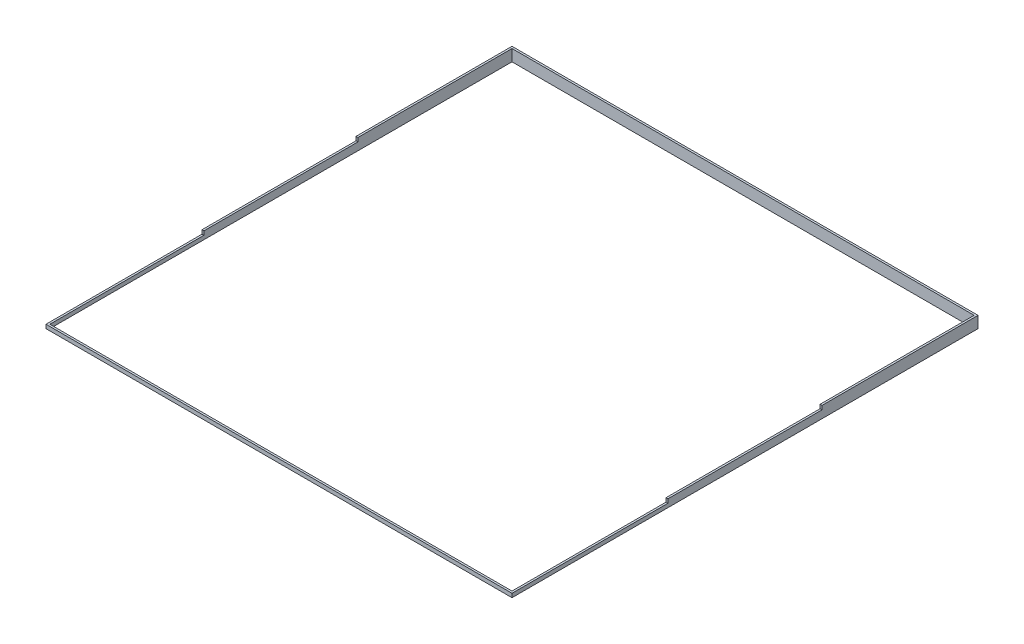
ISO-10303-21;
HEADER;
FILE_DESCRIPTION(('STEP AP214'),'2;1');
FILE_NAME('part.step','',(''),(''),'','','');
FILE_SCHEMA(('AUTOMOTIVE_DESIGN { 1 0 10303 214 1 1 1 1 }'));
ENDSEC;
DATA;
#1=APPLICATION_CONTEXT('core data for automotive mechanical design processes');
#2=APPLICATION_PROTOCOL_DEFINITION('international standard','automotive_design',2000,#1);
#3=PRODUCT_CONTEXT('',#1,'mechanical');
#4=PRODUCT('Part','Part','',(#3));
#5=PRODUCT_RELATED_PRODUCT_CATEGORY('part','',(#4));
#6=PRODUCT_DEFINITION_FORMATION('','',#4);
#7=PRODUCT_DEFINITION_CONTEXT('part definition',#1,'design');
#8=PRODUCT_DEFINITION('design','',#6,#7);
#9=PRODUCT_DEFINITION_SHAPE('','',#8);
#10=(LENGTH_UNIT() NAMED_UNIT(*) SI_UNIT(.MILLI.,.METRE.));
#11=(NAMED_UNIT(*) PLANE_ANGLE_UNIT() SI_UNIT($,.RADIAN.));
#12=(NAMED_UNIT(*) SI_UNIT($,.STERADIAN.) SOLID_ANGLE_UNIT());
#13=UNCERTAINTY_MEASURE_WITH_UNIT(LENGTH_MEASURE(1.E-05),#10,'distance_accuracy_value','');
#14=(GEOMETRIC_REPRESENTATION_CONTEXT(3) GLOBAL_UNCERTAINTY_ASSIGNED_CONTEXT((#13)) GLOBAL_UNIT_ASSIGNED_CONTEXT((#10,
#11,#12)) REPRESENTATION_CONTEXT('',''));
#15=CARTESIAN_POINT('',(0.,0.,0.));
#16=DIRECTION('',(0.,0.,1.));
#17=DIRECTION('',(1.,0.,0.));
#18=AXIS2_PLACEMENT_3D('',#15,#16,#17);
#19=CARTESIAN_POINT('',(-6050.,300.,-6050.));
#20=DIRECTION('',(1.,0.,0.));
#21=DIRECTION('',(0.,0.,-1.));
#22=AXIS2_PLACEMENT_3D('',#19,#20,#21);
#23=PLANE('',#22);
#24=DIRECTION('',(0.,-1.,0.));
#25=VECTOR('',#24,1.);
#26=CARTESIAN_POINT('',(-6050.,300.,6050.));
#27=LINE('',#26,#25);
#28=CARTESIAN_POINT('',(-6050.,100.,6050.));
#29=VERTEX_POINT('',#28);
#30=CARTESIAN_POINT('',(-6050.,0.,6050.));
#31=VERTEX_POINT('',#30);
#32=EDGE_CURVE('E176',#29,#31,#27,.T.);
#33=ORIENTED_EDGE('',*,*,#32,.F.);
#34=DIRECTION('',(0.,0.,1.));
#35=VECTOR('',#34,1.);
#36=CARTESIAN_POINT('',(-6050.,100.,6000.));
#37=LINE('',#36,#35);
#38=CARTESIAN_POINT('',(-6050.,100.,2000.));
#39=VERTEX_POINT('',#38);
#40=EDGE_CURVE('E160',#39,#29,#37,.T.);
#41=ORIENTED_EDGE('',*,*,#40,.F.);
#42=DIRECTION('',(0.,1.,0.));
#43=VECTOR('',#42,1.);
#44=CARTESIAN_POINT('',(-6050.,100.,2000.));
#45=LINE('',#44,#43);
#46=CARTESIAN_POINT('',(-6050.,200.,2000.));
#47=VERTEX_POINT('',#46);
#48=EDGE_CURVE('E280',#39,#47,#45,.T.);
#49=ORIENTED_EDGE('',*,*,#48,.T.);
#50=DIRECTION('',(0.,0.,1.));
#51=VECTOR('',#50,1.);
#52=CARTESIAN_POINT('',(-6050.,200.,2000.));
#53=LINE('',#52,#51);
#54=CARTESIAN_POINT('',(-6050.,200.,-2000.));
#55=VERTEX_POINT('',#54);
#56=EDGE_CURVE('E68',#55,#47,#53,.T.);
#57=ORIENTED_EDGE('',*,*,#56,.F.);
#58=DIRECTION('',(0.,1.,0.));
#59=VECTOR('',#58,1.);
#60=CARTESIAN_POINT('',(-6050.,200.,-2000.));
#61=LINE('',#60,#59);
#62=CARTESIAN_POINT('',(-6050.,300.,-2000.));
#63=VERTEX_POINT('',#62);
#64=EDGE_CURVE('E290',#55,#63,#61,.T.);
#65=ORIENTED_EDGE('',*,*,#64,.T.);
#66=DIRECTION('',(0.,0.,1.));
#67=VECTOR('',#66,1.);
#68=CARTESIAN_POINT('',(-6050.,300.,-6050.));
#69=LINE('',#68,#67);
#70=CARTESIAN_POINT('',(-6050.,300.,-6050.));
#71=VERTEX_POINT('',#70);
#72=EDGE_CURVE('E198',#71,#63,#69,.T.);
#73=ORIENTED_EDGE('',*,*,#72,.F.);
#74=DIRECTION('',(0.,-1.,0.));
#75=VECTOR('',#74,1.);
#76=CARTESIAN_POINT('',(-6050.,300.,-6050.));
#77=LINE('',#76,#75);
#78=CARTESIAN_POINT('',(-6050.,0.,-6050.));
#79=VERTEX_POINT('',#78);
#80=EDGE_CURVE('E186',#71,#79,#77,.T.);
#81=ORIENTED_EDGE('',*,*,#80,.T.);
#82=DIRECTION('',(0.,0.,1.));
#83=VECTOR('',#82,1.);
#84=CARTESIAN_POINT('',(-6050.,0.,-6050.));
#85=LINE('',#84,#83);
#86=EDGE_CURVE('E183',#79,#31,#85,.T.);
#87=ORIENTED_EDGE('',*,*,#86,.T.);
#88=EDGE_LOOP('',(#33,#41,#49,#57,#65,#73,#81,#87));
#89=FACE_BOUND('',#88,.T.);
#90=ADVANCED_FACE('F44',(#89),#23,.F.);
#91=CARTESIAN_POINT('',(-6050.,300.,6050.));
#92=DIRECTION('',(0.,0.,-1.));
#93=DIRECTION('',(-1.,0.,0.));
#94=AXIS2_PLACEMENT_3D('',#91,#92,#93);
#95=PLANE('',#94);
#96=DIRECTION('',(1.,0.,0.));
#97=VECTOR('',#96,1.);
#98=CARTESIAN_POINT('',(-6050.,100.,6050.));
#99=LINE('',#98,#97);
#100=CARTESIAN_POINT('',(6050.,100.,6050.));
#101=VERTEX_POINT('',#100);
#102=EDGE_CURVE('E164',#29,#101,#99,.T.);
#103=ORIENTED_EDGE('',*,*,#102,.F.);
#104=ORIENTED_EDGE('',*,*,#32,.T.);
#105=DIRECTION('',(1.,0.,0.));
#106=VECTOR('',#105,1.);
#107=CARTESIAN_POINT('',(-6050.,0.,6050.));
#108=LINE('',#107,#106);
#109=CARTESIAN_POINT('',(6050.,0.,6050.));
#110=VERTEX_POINT('',#109);
#111=EDGE_CURVE('E269',#31,#110,#108,.T.);
#112=ORIENTED_EDGE('',*,*,#111,.T.);
#113=DIRECTION('',(0.,-1.,0.));
#114=VECTOR('',#113,1.);
#115=CARTESIAN_POINT('',(6050.,300.,6050.));
#116=LINE('',#115,#114);
#117=EDGE_CURVE('E178',#101,#110,#116,.T.);
#118=ORIENTED_EDGE('',*,*,#117,.F.);
#119=EDGE_LOOP('',(#103,#104,#112,#118));
#120=FACE_BOUND('',#119,.T.);
#121=ADVANCED_FACE('F174',(#120),#95,.F.);
#122=CARTESIAN_POINT('',(6050.,300.,-6050.));
#123=DIRECTION('',(1.,0.,0.));
#124=DIRECTION('',(0.,0.,-1.));
#125=AXIS2_PLACEMENT_3D('',#122,#123,#124);
#126=PLANE('',#125);
#127=DIRECTION('',(0.,0.,-1.));
#128=VECTOR('',#127,1.);
#129=CARTESIAN_POINT('',(6050.,100.,6000.));
#130=LINE('',#129,#128);
#131=CARTESIAN_POINT('',(6050.,100.,2000.));
#132=VERTEX_POINT('',#131);
#133=EDGE_CURVE('E324',#101,#132,#130,.T.);
#134=ORIENTED_EDGE('',*,*,#133,.F.);
#135=ORIENTED_EDGE('',*,*,#117,.T.);
#136=DIRECTION('',(0.,0.,1.));
#137=VECTOR('',#136,1.);
#138=CARTESIAN_POINT('',(6050.,0.,-6050.));
#139=LINE('',#138,#137);
#140=CARTESIAN_POINT('',(6050.,0.,-6050.));
#141=VERTEX_POINT('',#140);
#142=EDGE_CURVE('E265',#141,#110,#139,.T.);
#143=ORIENTED_EDGE('',*,*,#142,.F.);
#144=DIRECTION('',(0.,-1.,0.));
#145=VECTOR('',#144,1.);
#146=CARTESIAN_POINT('',(6050.,300.,-6050.));
#147=LINE('',#146,#145);
#148=CARTESIAN_POINT('',(6050.,300.,-6050.));
#149=VERTEX_POINT('',#148);
#150=EDGE_CURVE('E192',#149,#141,#147,.T.);
#151=ORIENTED_EDGE('',*,*,#150,.F.);
#152=DIRECTION('',(0.,0.,1.));
#153=VECTOR('',#152,1.);
#154=CARTESIAN_POINT('',(6050.,300.,-6050.));
#155=LINE('',#154,#153);
#156=CARTESIAN_POINT('',(6050.,300.,-2000.));
#157=VERTEX_POINT('',#156);
#158=EDGE_CURVE('E254',#149,#157,#155,.T.);
#159=ORIENTED_EDGE('',*,*,#158,.T.);
#160=DIRECTION('',(0.,1.,0.));
#161=VECTOR('',#160,1.);
#162=CARTESIAN_POINT('',(6050.,200.,-2000.));
#163=LINE('',#162,#161);
#164=CARTESIAN_POINT('',(6050.,200.,-2000.));
#165=VERTEX_POINT('',#164);
#166=EDGE_CURVE('E332',#165,#157,#163,.T.);
#167=ORIENTED_EDGE('',*,*,#166,.F.);
#168=DIRECTION('',(0.,0.,-1.));
#169=VECTOR('',#168,1.);
#170=CARTESIAN_POINT('',(6050.,200.,2000.));
#171=LINE('',#170,#169);
#172=CARTESIAN_POINT('',(6050.,200.,2000.));
#173=VERTEX_POINT('',#172);
#174=EDGE_CURVE('E341',#173,#165,#171,.T.);
#175=ORIENTED_EDGE('',*,*,#174,.F.);
#176=DIRECTION('',(0.,1.,0.));
#177=VECTOR('',#176,1.);
#178=CARTESIAN_POINT('',(6050.,100.,2000.));
#179=LINE('',#178,#177);
#180=EDGE_CURVE('E313',#132,#173,#179,.T.);
#181=ORIENTED_EDGE('',*,*,#180,.F.);
#182=EDGE_LOOP('',(#134,#135,#143,#151,#159,#167,#175,#181));
#183=FACE_BOUND('',#182,.T.);
#184=ADVANCED_FACE('F361',(#183),#126,.T.);
#185=CARTESIAN_POINT('',(-6000.,-1.,6000.));
#186=DIRECTION('',(0.,0.,1.));
#187=DIRECTION('',(1.,0.,0.));
#188=AXIS2_PLACEMENT_3D('',#185,#186,#187);
#189=PLANE('',#188);
#190=DIRECTION('',(-1.,0.,0.));
#191=VECTOR('',#190,1.);
#192=CARTESIAN_POINT('',(-6050.,100.,6000.));
#193=LINE('',#192,#191);
#194=CARTESIAN_POINT('',(6000.,100.,6000.));
#195=VERTEX_POINT('',#194);
#196=CARTESIAN_POINT('',(-6000.,100.,6000.));
#197=VERTEX_POINT('',#196);
#198=EDGE_CURVE('E180',#195,#197,#193,.T.);
#199=ORIENTED_EDGE('',*,*,#198,.F.);
#200=DIRECTION('',(0.,1.,0.));
#201=VECTOR('',#200,1.);
#202=CARTESIAN_POINT('',(6000.,-1.,6000.));
#203=LINE('',#202,#201);
#204=CARTESIAN_POINT('',(6000.,0.,6000.));
#205=VERTEX_POINT('',#204);
#206=EDGE_CURVE('E213',#205,#195,#203,.T.);
#207=ORIENTED_EDGE('',*,*,#206,.F.);
#208=DIRECTION('',(-1.,0.,0.));
#209=VECTOR('',#208,1.);
#210=CARTESIAN_POINT('',(0.,0.,6000.));
#211=LINE('',#210,#209);
#212=CARTESIAN_POINT('',(-6000.,0.,6000.));
#213=VERTEX_POINT('',#212);
#214=EDGE_CURVE('E53',#205,#213,#211,.T.);
#215=ORIENTED_EDGE('',*,*,#214,.T.);
#216=DIRECTION('',(0.,1.,0.));
#217=VECTOR('',#216,1.);
#218=CARTESIAN_POINT('',(-6000.,-1.,6000.));
#219=LINE('',#218,#217);
#220=EDGE_CURVE('E211',#213,#197,#219,.T.);
#221=ORIENTED_EDGE('',*,*,#220,.T.);
#222=EDGE_LOOP('',(#199,#207,#215,#221));
#223=FACE_BOUND('',#222,.T.);
#224=ADVANCED_FACE('F210',(#223),#189,.F.);
#225=CARTESIAN_POINT('',(6000.,100.,2000.));
#226=DIRECTION('',(0.,0.,-1.));
#227=DIRECTION('',(-1.,0.,0.));
#228=AXIS2_PLACEMENT_3D('',#225,#226,#227);
#229=PLANE('',#228);
#230=DIRECTION('',(1.,0.,0.));
#231=VECTOR('',#230,1.);
#232=CARTESIAN_POINT('',(6050.,200.,2000.));
#233=LINE('',#232,#231);
#234=CARTESIAN_POINT('',(6000.,200.,2000.));
#235=VERTEX_POINT('',#234);
#236=EDGE_CURVE('E335',#235,#173,#233,.T.);
#237=ORIENTED_EDGE('',*,*,#236,.F.);
#238=DIRECTION('',(0.,1.,0.));
#239=VECTOR('',#238,1.);
#240=CARTESIAN_POINT('',(6000.,100.,2000.));
#241=LINE('',#240,#239);
#242=CARTESIAN_POINT('',(6000.,100.,2000.));
#243=VERTEX_POINT('',#242);
#244=EDGE_CURVE('E302',#243,#235,#241,.T.);
#245=ORIENTED_EDGE('',*,*,#244,.F.);
#246=DIRECTION('',(-1.,0.,0.));
#247=VECTOR('',#246,1.);
#248=CARTESIAN_POINT('',(6000.,100.,2000.));
#249=LINE('',#248,#247);
#250=EDGE_CURVE('E317',#132,#243,#249,.T.);
#251=ORIENTED_EDGE('',*,*,#250,.F.);
#252=ORIENTED_EDGE('',*,*,#180,.T.);
#253=EDGE_LOOP('',(#237,#245,#251,#252));
#254=FACE_BOUND('',#253,.T.);
#255=ADVANCED_FACE('F355',(#254),#229,.F.);
#256=CARTESIAN_POINT('',(0.,300.,0.));
#257=DIRECTION('',(0.,-1.,0.));
#258=DIRECTION('',(0.,0.,-1.));
#259=AXIS2_PLACEMENT_3D('',#256,#257,#258);
#260=PLANE('',#259);
#261=DIRECTION('',(0.,0.,-1.));
#262=VECTOR('',#261,1.);
#263=CARTESIAN_POINT('',(6000.,300.,-6000.));
#264=LINE('',#263,#262);
#265=CARTESIAN_POINT('',(6000.,300.,-2000.));
#266=VERTEX_POINT('',#265);
#267=CARTESIAN_POINT('',(6000.,300.,-6000.));
#268=VERTEX_POINT('',#267);
#269=EDGE_CURVE('E240',#266,#268,#264,.T.);
#270=ORIENTED_EDGE('',*,*,#269,.F.);
#271=DIRECTION('',(-1.,0.,0.));
#272=VECTOR('',#271,1.);
#273=CARTESIAN_POINT('',(6050.,300.,-2000.));
#274=LINE('',#273,#272);
#275=EDGE_CURVE('E338',#157,#266,#274,.T.);
#276=ORIENTED_EDGE('',*,*,#275,.F.);
#277=ORIENTED_EDGE('',*,*,#158,.F.);
#278=DIRECTION('',(1.,0.,0.));
#279=VECTOR('',#278,1.);
#280=CARTESIAN_POINT('',(-6050.,300.,-6050.));
#281=LINE('',#280,#279);
#282=EDGE_CURVE('E250',#71,#149,#281,.T.);
#283=ORIENTED_EDGE('',*,*,#282,.F.);
#284=ORIENTED_EDGE('',*,*,#72,.T.);
#285=DIRECTION('',(-1.,0.,0.));
#286=VECTOR('',#285,1.);
#287=CARTESIAN_POINT('',(-6000.,300.,-2000.));
#288=LINE('',#287,#286);
#289=CARTESIAN_POINT('',(-6000.,300.,-2000.));
#290=VERTEX_POINT('',#289);
#291=EDGE_CURVE('E298',#290,#63,#288,.T.);
#292=ORIENTED_EDGE('',*,*,#291,.F.);
#293=DIRECTION('',(0.,0.,1.));
#294=VECTOR('',#293,1.);
#295=CARTESIAN_POINT('',(-6000.,300.,-6000.));
#296=LINE('',#295,#294);
#297=CARTESIAN_POINT('',(-6000.,300.,-6000.));
#298=VERTEX_POINT('',#297);
#299=EDGE_CURVE('E242',#298,#290,#296,.T.);
#300=ORIENTED_EDGE('',*,*,#299,.F.);
#301=DIRECTION('',(-1.,0.,0.));
#302=VECTOR('',#301,1.);
#303=CARTESIAN_POINT('',(-6000.,300.,-6000.));
#304=LINE('',#303,#302);
#305=EDGE_CURVE('E247',#268,#298,#304,.T.);
#306=ORIENTED_EDGE('',*,*,#305,.F.);
#307=EDGE_LOOP('',(#270,#276,#277,#283,#284,#292,#300,#306));
#308=FACE_BOUND('',#307,.T.);
#309=ADVANCED_FACE('F367',(#308),#260,.F.);
#310=CARTESIAN_POINT('',(-6000.,100.,2000.));
#311=DIRECTION('',(0.,0.,-1.));
#312=DIRECTION('',(-1.,0.,0.));
#313=AXIS2_PLACEMENT_3D('',#310,#311,#312);
#314=PLANE('',#313);
#315=DIRECTION('',(1.,0.,0.));
#316=VECTOR('',#315,1.);
#317=CARTESIAN_POINT('',(-6000.,200.,2000.));
#318=LINE('',#317,#316);
#319=CARTESIAN_POINT('',(-6000.,200.,2000.));
#320=VERTEX_POINT('',#319);
#321=EDGE_CURVE('E294',#47,#320,#318,.T.);
#322=ORIENTED_EDGE('',*,*,#321,.F.);
#323=ORIENTED_EDGE('',*,*,#48,.F.);
#324=DIRECTION('',(-1.,0.,0.));
#325=VECTOR('',#324,1.);
#326=CARTESIAN_POINT('',(-6000.,100.,2000.));
#327=LINE('',#326,#325);
#328=CARTESIAN_POINT('',(-6000.,100.,2000.));
#329=VERTEX_POINT('',#328);
#330=EDGE_CURVE('E166',#329,#39,#327,.T.);
#331=ORIENTED_EDGE('',*,*,#330,.F.);
#332=DIRECTION('',(0.,1.,0.));
#333=VECTOR('',#332,1.);
#334=CARTESIAN_POINT('',(-6000.,100.,2000.));
#335=LINE('',#334,#333);
#336=EDGE_CURVE('E171',#329,#320,#335,.T.);
#337=ORIENTED_EDGE('',*,*,#336,.T.);
#338=EDGE_LOOP('',(#322,#323,#331,#337));
#339=FACE_BOUND('',#338,.T.);
#340=ADVANCED_FACE('F377',(#339),#314,.F.);
#341=CARTESIAN_POINT('',(-6050.,300.,-6050.));
#342=DIRECTION('',(0.,0.,-1.));
#343=DIRECTION('',(-1.,0.,0.));
#344=AXIS2_PLACEMENT_3D('',#341,#342,#343);
#345=PLANE('',#344);
#346=DIRECTION('',(1.,0.,0.));
#347=VECTOR('',#346,1.);
#348=CARTESIAN_POINT('',(-6050.,0.,-6050.));
#349=LINE('',#348,#347);
#350=EDGE_CURVE('E261',#79,#141,#349,.T.);
#351=ORIENTED_EDGE('',*,*,#350,.F.);
#352=ORIENTED_EDGE('',*,*,#80,.F.);
#353=ORIENTED_EDGE('',*,*,#282,.T.);
#354=ORIENTED_EDGE('',*,*,#150,.T.);
#355=EDGE_LOOP('',(#351,#352,#353,#354));
#356=FACE_BOUND('',#355,.T.);
#357=ADVANCED_FACE('F46',(#356),#345,.T.);
#358=CARTESIAN_POINT('',(0.,0.,0.));
#359=DIRECTION('',(0.,-1.,0.));
#360=DIRECTION('',(0.,0.,-1.));
#361=AXIS2_PLACEMENT_3D('',#358,#359,#360);
#362=PLANE('',#361);
#363=DIRECTION('',(0.,0.,1.));
#364=VECTOR('',#363,1.);
#365=CARTESIAN_POINT('',(6000.,0.,-8.88178419700125E-13));
#366=LINE('',#365,#364);
#367=CARTESIAN_POINT('',(6000.,0.,-6000.));
#368=VERTEX_POINT('',#367);
#369=EDGE_CURVE('E11',#368,#205,#366,.T.);
#370=ORIENTED_EDGE('',*,*,#369,.F.);
#371=DIRECTION('',(1.,0.,0.));
#372=VECTOR('',#371,1.);
#373=CARTESIAN_POINT('',(0.,0.,-6000.));
#374=LINE('',#373,#372);
#375=CARTESIAN_POINT('',(-6000.,0.,-6000.));
#376=VERTEX_POINT('',#375);
#377=EDGE_CURVE('E190',#376,#368,#374,.T.);
#378=ORIENTED_EDGE('',*,*,#377,.F.);
#379=DIRECTION('',(0.,0.,-1.));
#380=VECTOR('',#379,1.);
#381=CARTESIAN_POINT('',(-6000.,0.,8.88178419700125E-13));
#382=LINE('',#381,#380);
#383=EDGE_CURVE('E201',#213,#376,#382,.T.);
#384=ORIENTED_EDGE('',*,*,#383,.F.);
#385=ORIENTED_EDGE('',*,*,#214,.F.);
#386=EDGE_LOOP('',(#370,#378,#384,#385));
#387=FACE_BOUND('',#386,.T.);
#388=ORIENTED_EDGE('',*,*,#350,.T.);
#389=ORIENTED_EDGE('',*,*,#142,.T.);
#390=ORIENTED_EDGE('',*,*,#111,.F.);
#391=ORIENTED_EDGE('',*,*,#86,.F.);
#392=EDGE_LOOP('',(#388,#389,#390,#391));
#393=FACE_BOUND('',#392,.T.);
#394=ADVANCED_FACE('F227',(#387,#393),#362,.T.);
#395=CARTESIAN_POINT('',(6000.,-1.,-6000.));
#396=DIRECTION('',(1.,0.,0.));
#397=DIRECTION('',(0.,0.,-1.));
#398=AXIS2_PLACEMENT_3D('',#395,#396,#397);
#399=PLANE('',#398);
#400=DIRECTION('',(0.,0.,1.));
#401=VECTOR('',#400,1.);
#402=CARTESIAN_POINT('',(6000.,200.,2000.));
#403=LINE('',#402,#401);
#404=CARTESIAN_POINT('',(6000.,200.,-2000.));
#405=VERTEX_POINT('',#404);
#406=EDGE_CURVE('E60',#405,#235,#403,.T.);
#407=ORIENTED_EDGE('',*,*,#406,.F.);
#408=DIRECTION('',(0.,1.,0.));
#409=VECTOR('',#408,1.);
#410=CARTESIAN_POINT('',(6000.,200.,-2000.));
#411=LINE('',#410,#409);
#412=EDGE_CURVE('E331',#405,#266,#411,.T.);
#413=ORIENTED_EDGE('',*,*,#412,.T.);
#414=ORIENTED_EDGE('',*,*,#269,.T.);
#415=DIRECTION('',(0.,1.,0.));
#416=VECTOR('',#415,1.);
#417=CARTESIAN_POINT('',(6000.,-1.,-6000.));
#418=LINE('',#417,#416);
#419=EDGE_CURVE('E234',#368,#268,#418,.T.);
#420=ORIENTED_EDGE('',*,*,#419,.F.);
#421=ORIENTED_EDGE('',*,*,#369,.T.);
#422=ORIENTED_EDGE('',*,*,#206,.T.);
#423=DIRECTION('',(0.,0.,1.));
#424=VECTOR('',#423,1.);
#425=CARTESIAN_POINT('',(6000.,100.,6000.));
#426=LINE('',#425,#424);
#427=EDGE_CURVE('E327',#243,#195,#426,.T.);
#428=ORIENTED_EDGE('',*,*,#427,.F.);
#429=ORIENTED_EDGE('',*,*,#244,.T.);
#430=EDGE_LOOP('',(#407,#413,#414,#420,#421,#422,#428,#429));
#431=FACE_BOUND('',#430,.T.);
#432=ADVANCED_FACE('F237',(#431),#399,.F.);
#433=CARTESIAN_POINT('',(-6000.,-1.,-6000.));
#434=DIRECTION('',(-1.,0.,0.));
#435=DIRECTION('',(0.,0.,1.));
#436=AXIS2_PLACEMENT_3D('',#433,#434,#435);
#437=PLANE('',#436);
#438=ORIENTED_EDGE('',*,*,#299,.T.);
#439=DIRECTION('',(0.,1.,0.));
#440=VECTOR('',#439,1.);
#441=CARTESIAN_POINT('',(-6000.,200.,-2000.));
#442=LINE('',#441,#440);
#443=CARTESIAN_POINT('',(-6000.,200.,-2000.));
#444=VERTEX_POINT('',#443);
#445=EDGE_CURVE('E291',#444,#290,#442,.T.);
#446=ORIENTED_EDGE('',*,*,#445,.F.);
#447=DIRECTION('',(0.,0.,-1.));
#448=VECTOR('',#447,1.);
#449=CARTESIAN_POINT('',(-6000.,200.,2000.));
#450=LINE('',#449,#448);
#451=EDGE_CURVE('E301',#320,#444,#450,.T.);
#452=ORIENTED_EDGE('',*,*,#451,.F.);
#453=ORIENTED_EDGE('',*,*,#336,.F.);
#454=DIRECTION('',(0.,0.,-1.));
#455=VECTOR('',#454,1.);
#456=CARTESIAN_POINT('',(-6000.,100.,6000.));
#457=LINE('',#456,#455);
#458=EDGE_CURVE('E223',#197,#329,#457,.T.);
#459=ORIENTED_EDGE('',*,*,#458,.F.);
#460=ORIENTED_EDGE('',*,*,#220,.F.);
#461=ORIENTED_EDGE('',*,*,#383,.T.);
#462=DIRECTION('',(0.,1.,0.));
#463=VECTOR('',#462,1.);
#464=CARTESIAN_POINT('',(-6000.,-1.,-6000.));
#465=LINE('',#464,#463);
#466=EDGE_CURVE('E225',#376,#298,#465,.T.);
#467=ORIENTED_EDGE('',*,*,#466,.T.);
#468=EDGE_LOOP('',(#438,#446,#452,#453,#459,#460,#461,#467));
#469=FACE_BOUND('',#468,.T.);
#470=ADVANCED_FACE('F220',(#469),#437,.F.);
#471=CARTESIAN_POINT('',(-6000.,-1.,-6000.));
#472=DIRECTION('',(0.,0.,-1.));
#473=DIRECTION('',(-1.,0.,0.));
#474=AXIS2_PLACEMENT_3D('',#471,#472,#473);
#475=PLANE('',#474);
#476=ORIENTED_EDGE('',*,*,#377,.T.);
#477=ORIENTED_EDGE('',*,*,#419,.T.);
#478=ORIENTED_EDGE('',*,*,#305,.T.);
#479=ORIENTED_EDGE('',*,*,#466,.F.);
#480=EDGE_LOOP('',(#476,#477,#478,#479));
#481=FACE_BOUND('',#480,.T.);
#482=ADVANCED_FACE('F232',(#481),#475,.F.);
#483=CARTESIAN_POINT('',(0.,100.,0.));
#484=DIRECTION('',(0.,1.,0.));
#485=DIRECTION('',(0.,0.,1.));
#486=AXIS2_PLACEMENT_3D('',#483,#484,#485);
#487=PLANE('',#486);
#488=ORIENTED_EDGE('',*,*,#458,.T.);
#489=ORIENTED_EDGE('',*,*,#330,.T.);
#490=ORIENTED_EDGE('',*,*,#40,.T.);
#491=ORIENTED_EDGE('',*,*,#102,.T.);
#492=ORIENTED_EDGE('',*,*,#133,.T.);
#493=ORIENTED_EDGE('',*,*,#250,.T.);
#494=ORIENTED_EDGE('',*,*,#427,.T.);
#495=ORIENTED_EDGE('',*,*,#198,.T.);
#496=EDGE_LOOP('',(#488,#489,#490,#491,#492,#493,#494,#495));
#497=FACE_BOUND('',#496,.T.);
#498=ADVANCED_FACE('F163',(#497),#487,.T.);
#499=CARTESIAN_POINT('',(-6000.,200.,-2000.));
#500=DIRECTION('',(0.,0.,-1.));
#501=DIRECTION('',(-1.,0.,0.));
#502=AXIS2_PLACEMENT_3D('',#499,#500,#501);
#503=PLANE('',#502);
#504=ORIENTED_EDGE('',*,*,#291,.T.);
#505=ORIENTED_EDGE('',*,*,#64,.F.);
#506=DIRECTION('',(-1.,0.,0.));
#507=VECTOR('',#506,1.);
#508=CARTESIAN_POINT('',(-6000.,200.,-2000.));
#509=LINE('',#508,#507);
#510=EDGE_CURVE('E307',#444,#55,#509,.T.);
#511=ORIENTED_EDGE('',*,*,#510,.F.);
#512=ORIENTED_EDGE('',*,*,#445,.T.);
#513=EDGE_LOOP('',(#504,#505,#511,#512));
#514=FACE_BOUND('',#513,.T.);
#515=ADVANCED_FACE('F374',(#514),#503,.F.);
#516=CARTESIAN_POINT('',(0.,200.,0.));
#517=DIRECTION('',(0.,1.,0.));
#518=DIRECTION('',(0.,0.,1.));
#519=AXIS2_PLACEMENT_3D('',#516,#517,#518);
#520=PLANE('',#519);
#521=ORIENTED_EDGE('',*,*,#451,.T.);
#522=ORIENTED_EDGE('',*,*,#510,.T.);
#523=ORIENTED_EDGE('',*,*,#56,.T.);
#524=ORIENTED_EDGE('',*,*,#321,.T.);
#525=EDGE_LOOP('',(#521,#522,#523,#524));
#526=FACE_BOUND('',#525,.T.);
#527=ADVANCED_FACE('F375',(#526),#520,.T.);
#528=CARTESIAN_POINT('',(6050.,200.,-2000.));
#529=DIRECTION('',(0.,0.,-1.));
#530=DIRECTION('',(-1.,0.,0.));
#531=AXIS2_PLACEMENT_3D('',#528,#529,#530);
#532=PLANE('',#531);
#533=ORIENTED_EDGE('',*,*,#275,.T.);
#534=ORIENTED_EDGE('',*,*,#412,.F.);
#535=DIRECTION('',(-1.,0.,0.));
#536=VECTOR('',#535,1.);
#537=CARTESIAN_POINT('',(6050.,200.,-2000.));
#538=LINE('',#537,#536);
#539=EDGE_CURVE('E346',#165,#405,#538,.T.);
#540=ORIENTED_EDGE('',*,*,#539,.F.);
#541=ORIENTED_EDGE('',*,*,#166,.T.);
#542=EDGE_LOOP('',(#533,#534,#540,#541));
#543=FACE_BOUND('',#542,.T.);
#544=ADVANCED_FACE('F365',(#543),#532,.F.);
#545=CARTESIAN_POINT('',(0.,200.,0.));
#546=DIRECTION('',(0.,1.,0.));
#547=DIRECTION('',(0.,0.,1.));
#548=AXIS2_PLACEMENT_3D('',#545,#546,#547);
#549=PLANE('',#548);
#550=ORIENTED_EDGE('',*,*,#174,.T.);
#551=ORIENTED_EDGE('',*,*,#539,.T.);
#552=ORIENTED_EDGE('',*,*,#406,.T.);
#553=ORIENTED_EDGE('',*,*,#236,.T.);
#554=EDGE_LOOP('',(#550,#551,#552,#553));
#555=FACE_BOUND('',#554,.T.);
#556=ADVANCED_FACE('F358',(#555),#549,.T.);
#557=CLOSED_SHELL('',(#90,#121,#184,#224,#255,#309,#340,#357,#394,#432,#470,#482,#498,#515,#527,
#544,#556));
#558=MANIFOLD_SOLID_BREP('B2',#557);
#559=ADVANCED_BREP_SHAPE_REPRESENTATION('',(#18,#558),#14);
#560=SHAPE_DEFINITION_REPRESENTATION(#9,#559);
ENDSEC;
END-ISO-10303-21;
